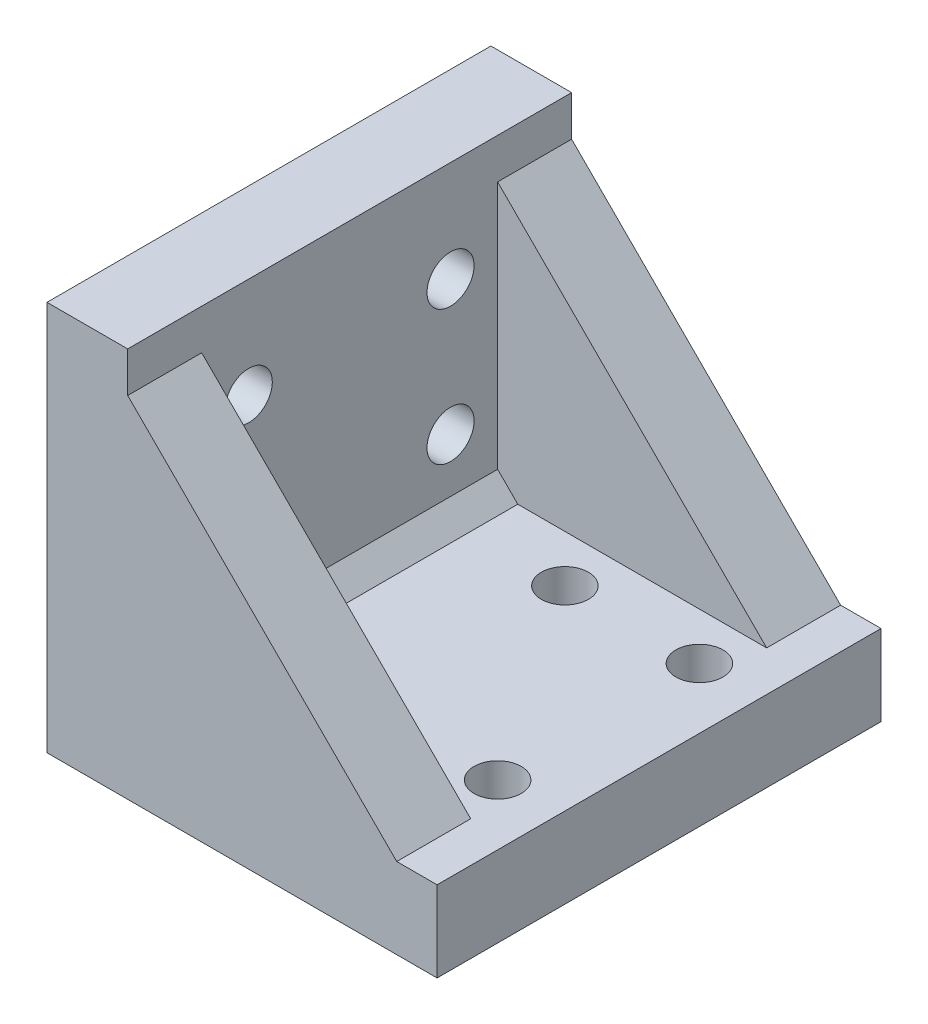
ISO-10303-21;
HEADER;
FILE_DESCRIPTION(('STEP AP214'),'2;1');
FILE_NAME('part.step','',(''),(''),'','','');
FILE_SCHEMA(('AUTOMOTIVE_DESIGN { 1 0 10303 214 1 1 1 1 }'));
ENDSEC;
DATA;
#1=APPLICATION_CONTEXT('core data for automotive mechanical design processes');
#2=APPLICATION_PROTOCOL_DEFINITION('international standard','automotive_design',2000,#1);
#3=PRODUCT_CONTEXT('',#1,'mechanical');
#4=PRODUCT('Part','Part','',(#3));
#5=PRODUCT_RELATED_PRODUCT_CATEGORY('part','',(#4));
#6=PRODUCT_DEFINITION_FORMATION('','',#4);
#7=PRODUCT_DEFINITION_CONTEXT('part definition',#1,'design');
#8=PRODUCT_DEFINITION('design','',#6,#7);
#9=PRODUCT_DEFINITION_SHAPE('','',#8);
#10=(LENGTH_UNIT() NAMED_UNIT(*) SI_UNIT(.MILLI.,.METRE.));
#11=(NAMED_UNIT(*) PLANE_ANGLE_UNIT() SI_UNIT($,.RADIAN.));
#12=(NAMED_UNIT(*) SI_UNIT($,.STERADIAN.) SOLID_ANGLE_UNIT());
#13=UNCERTAINTY_MEASURE_WITH_UNIT(LENGTH_MEASURE(1.E-05),#10,'distance_accuracy_value','');
#14=(GEOMETRIC_REPRESENTATION_CONTEXT(3) GLOBAL_UNCERTAINTY_ASSIGNED_CONTEXT((#13)) GLOBAL_UNIT_ASSIGNED_CONTEXT((#10,
#11,#12)) REPRESENTATION_CONTEXT('',''));
#15=CARTESIAN_POINT('',(0.,0.,0.));
#16=DIRECTION('',(0.,0.,1.));
#17=DIRECTION('',(1.,0.,0.));
#18=AXIS2_PLACEMENT_3D('',#15,#16,#17);
#19=CARTESIAN_POINT('',(6.,6.,16.5));
#20=DIRECTION('',(0.,-1.,0.));
#21=DIRECTION('',(1.,0.,0.));
#22=AXIS2_PLACEMENT_3D('',#19,#20,#21);
#23=PLANE('',#22);
#24=CARTESIAN_POINT('',(14.5,6.,7.5));
#25=DIRECTION('',(0.,1.,0.));
#26=DIRECTION('',(-1.,0.,0.));
#27=AXIS2_PLACEMENT_3D('',#24,#25,#26);
#28=CIRCLE('',#27,1.75);
#29=CARTESIAN_POINT('',(12.75,6.,7.5));
#30=VERTEX_POINT('',#29);
#31=EDGE_CURVE('E151',#30,#30,#28,.T.);
#32=ORIENTED_EDGE('',*,*,#31,.F.);
#33=EDGE_LOOP('',(#32));
#34=FACE_BOUND('',#33,.T.);
#35=CARTESIAN_POINT('',(14.5,6.,-7.5));
#36=DIRECTION('',(0.,1.,0.));
#37=DIRECTION('',(-1.,0.,0.));
#38=AXIS2_PLACEMENT_3D('',#35,#36,#37);
#39=CIRCLE('',#38,1.75);
#40=CARTESIAN_POINT('',(12.75,6.,-7.5));
#41=VERTEX_POINT('',#40);
#42=EDGE_CURVE('E144',#41,#41,#39,.T.);
#43=ORIENTED_EDGE('',*,*,#42,.F.);
#44=EDGE_LOOP('',(#43));
#45=FACE_BOUND('',#44,.T.);
#46=CARTESIAN_POINT('',(24.5,6.,-7.5));
#47=DIRECTION('',(0.,1.,0.));
#48=DIRECTION('',(-1.,0.,0.));
#49=AXIS2_PLACEMENT_3D('',#46,#47,#48);
#50=CIRCLE('',#49,1.75);
#51=CARTESIAN_POINT('',(22.75,6.,-7.5));
#52=VERTEX_POINT('',#51);
#53=EDGE_CURVE('E152',#52,#52,#50,.T.);
#54=ORIENTED_EDGE('',*,*,#53,.F.);
#55=EDGE_LOOP('',(#54));
#56=FACE_BOUND('',#55,.T.);
#57=CARTESIAN_POINT('',(24.5,6.,7.5));
#58=DIRECTION('',(0.,1.,0.));
#59=DIRECTION('',(-1.,0.,0.));
#60=AXIS2_PLACEMENT_3D('',#57,#58,#59);
#61=CIRCLE('',#60,1.75);
#62=CARTESIAN_POINT('',(22.75,6.,7.5));
#63=VERTEX_POINT('',#62);
#64=EDGE_CURVE('E142',#63,#63,#61,.T.);
#65=ORIENTED_EDGE('',*,*,#64,.F.);
#66=EDGE_LOOP('',(#65));
#67=FACE_BOUND('',#66,.T.);
#68=DIRECTION('',(1.,0.,0.));
#69=VECTOR('',#68,1.);
#70=CARTESIAN_POINT('',(26.,6.,-11.));
#71=LINE('',#70,#69);
#72=CARTESIAN_POINT('',(7.5,6.,-11.));
#73=VERTEX_POINT('',#72);
#74=CARTESIAN_POINT('',(26.,6.,-11.));
#75=VERTEX_POINT('',#74);
#76=EDGE_CURVE('E247',#73,#75,#71,.T.);
#77=ORIENTED_EDGE('',*,*,#76,.F.);
#78=DIRECTION('',(0.,0.,1.));
#79=VECTOR('',#78,1.);
#80=CARTESIAN_POINT('',(7.5,6.,11.));
#81=LINE('',#80,#79);
#82=CARTESIAN_POINT('',(7.5,6.,11.));
#83=VERTEX_POINT('',#82);
#84=EDGE_CURVE('E45',#73,#83,#81,.T.);
#85=ORIENTED_EDGE('',*,*,#84,.T.);
#86=DIRECTION('',(1.,0.,0.));
#87=VECTOR('',#86,1.);
#88=CARTESIAN_POINT('',(26.,6.,11.));
#89=LINE('',#88,#87);
#90=CARTESIAN_POINT('',(26.,6.,11.));
#91=VERTEX_POINT('',#90);
#92=EDGE_CURVE('E116',#83,#91,#89,.T.);
#93=ORIENTED_EDGE('',*,*,#92,.T.);
#94=DIRECTION('',(0.,0.,1.));
#95=VECTOR('',#94,1.);
#96=CARTESIAN_POINT('',(26.,6.,11.));
#97=LINE('',#96,#95);
#98=CARTESIAN_POINT('',(26.,6.,16.5));
#99=VERTEX_POINT('',#98);
#100=EDGE_CURVE('E119',#91,#99,#97,.T.);
#101=ORIENTED_EDGE('',*,*,#100,.T.);
#102=DIRECTION('',(-1.,0.,0.));
#103=VECTOR('',#102,1.);
#104=CARTESIAN_POINT('',(6.,6.,16.5));
#105=LINE('',#104,#103);
#106=CARTESIAN_POINT('',(29.,6.,16.5));
#107=VERTEX_POINT('',#106);
#108=EDGE_CURVE('E198',#107,#99,#105,.T.);
#109=ORIENTED_EDGE('',*,*,#108,.F.);
#110=DIRECTION('',(0.,0.,-1.));
#111=VECTOR('',#110,1.);
#112=CARTESIAN_POINT('',(29.,6.,16.5));
#113=LINE('',#112,#111);
#114=CARTESIAN_POINT('',(29.,6.,-16.5));
#115=VERTEX_POINT('',#114);
#116=EDGE_CURVE('E226',#107,#115,#113,.T.);
#117=ORIENTED_EDGE('',*,*,#116,.T.);
#118=DIRECTION('',(-1.,0.,0.));
#119=VECTOR('',#118,1.);
#120=CARTESIAN_POINT('',(6.,6.,-16.5));
#121=LINE('',#120,#119);
#122=CARTESIAN_POINT('',(26.,6.,-16.5));
#123=VERTEX_POINT('',#122);
#124=EDGE_CURVE('E211',#115,#123,#121,.T.);
#125=ORIENTED_EDGE('',*,*,#124,.T.);
#126=DIRECTION('',(0.,0.,-1.));
#127=VECTOR('',#126,1.);
#128=CARTESIAN_POINT('',(26.,6.,-11.));
#129=LINE('',#128,#127);
#130=EDGE_CURVE('E141',#75,#123,#129,.T.);
#131=ORIENTED_EDGE('',*,*,#130,.F.);
#132=EDGE_LOOP('',(#77,#85,#93,#101,#109,#117,#125,#131));
#133=FACE_BOUND('',#132,.T.);
#134=ADVANCED_FACE('F36',(#34,#45,#56,#67,#133),#23,.F.);
#135=CARTESIAN_POINT('',(5.99999999999999,29.,16.5));
#136=DIRECTION('',(-1.,0.,0.));
#137=DIRECTION('',(0.,-1.,0.));
#138=AXIS2_PLACEMENT_3D('',#135,#136,#137);
#139=PLANE('',#138);
#140=CARTESIAN_POINT('',(6.,21.5,-7.5));
#141=DIRECTION('',(1.,0.,0.));
#142=DIRECTION('',(0.,1.,0.));
#143=AXIS2_PLACEMENT_3D('',#140,#141,#142);
#144=CIRCLE('',#143,1.75);
#145=CARTESIAN_POINT('',(6.,23.25,-7.5));
#146=VERTEX_POINT('',#145);
#147=EDGE_CURVE('E175',#146,#146,#144,.T.);
#148=ORIENTED_EDGE('',*,*,#147,.F.);
#149=EDGE_LOOP('',(#148));
#150=FACE_BOUND('',#149,.T.);
#151=CARTESIAN_POINT('',(6.,11.5,-7.5));
#152=DIRECTION('',(1.,0.,0.));
#153=DIRECTION('',(0.,1.,0.));
#154=AXIS2_PLACEMENT_3D('',#151,#152,#153);
#155=CIRCLE('',#154,1.75);
#156=CARTESIAN_POINT('',(6.,13.25,-7.5));
#157=VERTEX_POINT('',#156);
#158=EDGE_CURVE('E168',#157,#157,#155,.T.);
#159=ORIENTED_EDGE('',*,*,#158,.F.);
#160=EDGE_LOOP('',(#159));
#161=FACE_BOUND('',#160,.T.);
#162=CARTESIAN_POINT('',(6.,11.5,7.5));
#163=DIRECTION('',(1.,0.,0.));
#164=DIRECTION('',(0.,1.,0.));
#165=AXIS2_PLACEMENT_3D('',#162,#163,#164);
#166=CIRCLE('',#165,1.75);
#167=CARTESIAN_POINT('',(6.,13.25,7.5));
#168=VERTEX_POINT('',#167);
#169=EDGE_CURVE('E176',#168,#168,#166,.T.);
#170=ORIENTED_EDGE('',*,*,#169,.F.);
#171=EDGE_LOOP('',(#170));
#172=FACE_BOUND('',#171,.T.);
#173=CARTESIAN_POINT('',(6.,21.5,7.5));
#174=DIRECTION('',(1.,0.,0.));
#175=DIRECTION('',(0.,1.,0.));
#176=AXIS2_PLACEMENT_3D('',#173,#174,#175);
#177=CIRCLE('',#176,1.75);
#178=CARTESIAN_POINT('',(6.,23.25,7.5));
#179=VERTEX_POINT('',#178);
#180=EDGE_CURVE('E167',#179,#179,#177,.T.);
#181=ORIENTED_EDGE('',*,*,#180,.F.);
#182=EDGE_LOOP('',(#181));
#183=FACE_BOUND('',#182,.T.);
#184=DIRECTION('',(0.,-1.,0.));
#185=VECTOR('',#184,1.);
#186=CARTESIAN_POINT('',(6.,6.,11.));
#187=LINE('',#186,#185);
#188=CARTESIAN_POINT('',(6.,26.,11.));
#189=VERTEX_POINT('',#188);
#190=CARTESIAN_POINT('',(6.,7.50000000000001,11.));
#191=VERTEX_POINT('',#190);
#192=EDGE_CURVE('E125',#189,#191,#187,.T.);
#193=ORIENTED_EDGE('',*,*,#192,.T.);
#194=DIRECTION('',(0.,0.,-1.));
#195=VECTOR('',#194,1.);
#196=CARTESIAN_POINT('',(6.,7.50000000000001,-11.));
#197=LINE('',#196,#195);
#198=CARTESIAN_POINT('',(6.,7.50000000000001,-11.));
#199=VERTEX_POINT('',#198);
#200=EDGE_CURVE('E232',#191,#199,#197,.T.);
#201=ORIENTED_EDGE('',*,*,#200,.T.);
#202=DIRECTION('',(0.,-1.,0.));
#203=VECTOR('',#202,1.);
#204=CARTESIAN_POINT('',(6.,6.,-11.));
#205=LINE('',#204,#203);
#206=CARTESIAN_POINT('',(6.,26.,-11.));
#207=VERTEX_POINT('',#206);
#208=EDGE_CURVE('E238',#207,#199,#205,.T.);
#209=ORIENTED_EDGE('',*,*,#208,.F.);
#210=DIRECTION('',(0.,0.,-1.));
#211=VECTOR('',#210,1.);
#212=CARTESIAN_POINT('',(6.,26.,-11.));
#213=LINE('',#212,#211);
#214=CARTESIAN_POINT('',(5.99999999999999,26.,-16.5));
#215=VERTEX_POINT('',#214);
#216=EDGE_CURVE('E252',#207,#215,#213,.T.);
#217=ORIENTED_EDGE('',*,*,#216,.T.);
#218=DIRECTION('',(0.,1.,0.));
#219=VECTOR('',#218,1.);
#220=CARTESIAN_POINT('',(5.99999999999999,29.,-16.5));
#221=LINE('',#220,#219);
#222=CARTESIAN_POINT('',(5.99999999999999,29.,-16.5));
#223=VERTEX_POINT('',#222);
#224=EDGE_CURVE('E213',#215,#223,#221,.T.);
#225=ORIENTED_EDGE('',*,*,#224,.T.);
#226=DIRECTION('',(0.,0.,-1.));
#227=VECTOR('',#226,1.);
#228=CARTESIAN_POINT('',(5.99999999999999,29.,16.5));
#229=LINE('',#228,#227);
#230=CARTESIAN_POINT('',(5.99999999999999,29.,16.5));
#231=VERTEX_POINT('',#230);
#232=EDGE_CURVE('E223',#231,#223,#229,.T.);
#233=ORIENTED_EDGE('',*,*,#232,.F.);
#234=DIRECTION('',(0.,1.,0.));
#235=VECTOR('',#234,1.);
#236=CARTESIAN_POINT('',(5.99999999999999,29.,16.5));
#237=LINE('',#236,#235);
#238=CARTESIAN_POINT('',(6.,26.,16.5));
#239=VERTEX_POINT('',#238);
#240=EDGE_CURVE('E200',#239,#231,#237,.T.);
#241=ORIENTED_EDGE('',*,*,#240,.F.);
#242=DIRECTION('',(0.,0.,1.));
#243=VECTOR('',#242,1.);
#244=CARTESIAN_POINT('',(6.,26.,11.));
#245=LINE('',#244,#243);
#246=EDGE_CURVE('E133',#189,#239,#245,.T.);
#247=ORIENTED_EDGE('',*,*,#246,.F.);
#248=EDGE_LOOP('',(#193,#201,#209,#217,#225,#233,#241,#247));
#249=FACE_BOUND('',#248,.T.);
#250=ADVANCED_FACE('F237',(#150,#161,#172,#183,#249),#139,.F.);
#251=CARTESIAN_POINT('',(29.,0.,16.5));
#252=DIRECTION('',(0.,1.,0.));
#253=DIRECTION('',(-1.,0.,0.));
#254=AXIS2_PLACEMENT_3D('',#251,#252,#253);
#255=PLANE('',#254);
#256=CARTESIAN_POINT('',(24.5,0.,7.5));
#257=DIRECTION('',(0.,1.,0.));
#258=DIRECTION('',(-1.,0.,0.));
#259=AXIS2_PLACEMENT_3D('',#256,#257,#258);
#260=CIRCLE('',#259,1.75);
#261=CARTESIAN_POINT('',(22.75,0.,7.5));
#262=VERTEX_POINT('',#261);
#263=EDGE_CURVE('E155',#262,#262,#260,.F.);
#264=ORIENTED_EDGE('',*,*,#263,.F.);
#265=EDGE_LOOP('',(#264));
#266=FACE_BOUND('',#265,.T.);
#267=CARTESIAN_POINT('',(24.5,0.,-7.5));
#268=DIRECTION('',(0.,1.,0.));
#269=DIRECTION('',(-1.,0.,0.));
#270=AXIS2_PLACEMENT_3D('',#267,#268,#269);
#271=CIRCLE('',#270,1.75);
#272=CARTESIAN_POINT('',(22.75,0.,-7.5));
#273=VERTEX_POINT('',#272);
#274=EDGE_CURVE('E148',#273,#273,#271,.F.);
#275=ORIENTED_EDGE('',*,*,#274,.F.);
#276=EDGE_LOOP('',(#275));
#277=FACE_BOUND('',#276,.T.);
#278=CARTESIAN_POINT('',(14.5,0.,-7.5));
#279=DIRECTION('',(0.,1.,0.));
#280=DIRECTION('',(-1.,0.,0.));
#281=AXIS2_PLACEMENT_3D('',#278,#279,#280);
#282=CIRCLE('',#281,1.75);
#283=CARTESIAN_POINT('',(12.75,0.,-7.5));
#284=VERTEX_POINT('',#283);
#285=EDGE_CURVE('E147',#284,#284,#282,.F.);
#286=ORIENTED_EDGE('',*,*,#285,.F.);
#287=EDGE_LOOP('',(#286));
#288=FACE_BOUND('',#287,.T.);
#289=CARTESIAN_POINT('',(14.5,0.,7.5));
#290=DIRECTION('',(0.,1.,0.));
#291=DIRECTION('',(-1.,0.,0.));
#292=AXIS2_PLACEMENT_3D('',#289,#290,#291);
#293=CIRCLE('',#292,1.75);
#294=CARTESIAN_POINT('',(12.75,0.,7.5));
#295=VERTEX_POINT('',#294);
#296=EDGE_CURVE('E164',#295,#295,#293,.F.);
#297=ORIENTED_EDGE('',*,*,#296,.F.);
#298=EDGE_LOOP('',(#297));
#299=FACE_BOUND('',#298,.T.);
#300=DIRECTION('',(1.,0.,0.));
#301=VECTOR('',#300,1.);
#302=CARTESIAN_POINT('',(29.,0.,-16.5));
#303=LINE('',#302,#301);
#304=CARTESIAN_POINT('',(0.,0.,-16.5));
#305=VERTEX_POINT('',#304);
#306=CARTESIAN_POINT('',(29.,0.,-16.5));
#307=VERTEX_POINT('',#306);
#308=EDGE_CURVE('E191',#305,#307,#303,.T.);
#309=ORIENTED_EDGE('',*,*,#308,.T.);
#310=DIRECTION('',(0.,0.,-1.));
#311=VECTOR('',#310,1.);
#312=CARTESIAN_POINT('',(29.,0.,16.5));
#313=LINE('',#312,#311);
#314=CARTESIAN_POINT('',(29.,0.,16.5));
#315=VERTEX_POINT('',#314);
#316=EDGE_CURVE('E229',#315,#307,#313,.T.);
#317=ORIENTED_EDGE('',*,*,#316,.F.);
#318=DIRECTION('',(1.,0.,0.));
#319=VECTOR('',#318,1.);
#320=CARTESIAN_POINT('',(29.,0.,16.5));
#321=LINE('',#320,#319);
#322=CARTESIAN_POINT('',(0.,0.,16.5));
#323=VERTEX_POINT('',#322);
#324=EDGE_CURVE('E192',#323,#315,#321,.T.);
#325=ORIENTED_EDGE('',*,*,#324,.F.);
#326=DIRECTION('',(0.,0.,-1.));
#327=VECTOR('',#326,1.);
#328=CARTESIAN_POINT('',(0.,0.,16.5));
#329=LINE('',#328,#327);
#330=EDGE_CURVE('E206',#323,#305,#329,.T.);
#331=ORIENTED_EDGE('',*,*,#330,.T.);
#332=EDGE_LOOP('',(#309,#317,#325,#331));
#333=FACE_BOUND('',#332,.T.);
#334=ADVANCED_FACE('F274',(#266,#277,#288,#299,#333),#255,.F.);
#335=CARTESIAN_POINT('',(29.,6.,16.5));
#336=DIRECTION('',(-1.,0.,0.));
#337=DIRECTION('',(0.,-1.,0.));
#338=AXIS2_PLACEMENT_3D('',#335,#336,#337);
#339=PLANE('',#338);
#340=DIRECTION('',(0.,1.,0.));
#341=VECTOR('',#340,1.);
#342=CARTESIAN_POINT('',(29.,6.,-16.5));
#343=LINE('',#342,#341);
#344=EDGE_CURVE('E209',#307,#115,#343,.T.);
#345=ORIENTED_EDGE('',*,*,#344,.T.);
#346=ORIENTED_EDGE('',*,*,#116,.F.);
#347=DIRECTION('',(0.,1.,0.));
#348=VECTOR('',#347,1.);
#349=CARTESIAN_POINT('',(29.,6.,16.5));
#350=LINE('',#349,#348);
#351=EDGE_CURVE('E195',#315,#107,#350,.T.);
#352=ORIENTED_EDGE('',*,*,#351,.F.);
#353=ORIENTED_EDGE('',*,*,#316,.T.);
#354=EDGE_LOOP('',(#345,#346,#352,#353));
#355=FACE_BOUND('',#354,.T.);
#356=ADVANCED_FACE('F271',(#355),#339,.F.);
#357=CARTESIAN_POINT('',(0.,29.,16.5));
#358=DIRECTION('',(0.,-1.,0.));
#359=DIRECTION('',(0.,0.,-1.));
#360=AXIS2_PLACEMENT_3D('',#357,#358,#359);
#361=PLANE('',#360);
#362=DIRECTION('',(-1.,0.,0.));
#363=VECTOR('',#362,1.);
#364=CARTESIAN_POINT('',(0.,29.,-16.5));
#365=LINE('',#364,#363);
#366=CARTESIAN_POINT('',(0.,29.,-16.5));
#367=VERTEX_POINT('',#366);
#368=EDGE_CURVE('E215',#223,#367,#365,.T.);
#369=ORIENTED_EDGE('',*,*,#368,.T.);
#370=DIRECTION('',(0.,0.,-1.));
#371=VECTOR('',#370,1.);
#372=CARTESIAN_POINT('',(0.,29.,16.5));
#373=LINE('',#372,#371);
#374=CARTESIAN_POINT('',(0.,29.,16.5));
#375=VERTEX_POINT('',#374);
#376=EDGE_CURVE('E220',#375,#367,#373,.T.);
#377=ORIENTED_EDGE('',*,*,#376,.F.);
#378=DIRECTION('',(-1.,0.,0.));
#379=VECTOR('',#378,1.);
#380=CARTESIAN_POINT('',(0.,29.,16.5));
#381=LINE('',#380,#379);
#382=EDGE_CURVE('E202',#231,#375,#381,.T.);
#383=ORIENTED_EDGE('',*,*,#382,.F.);
#384=ORIENTED_EDGE('',*,*,#232,.T.);
#385=EDGE_LOOP('',(#369,#377,#383,#384));
#386=FACE_BOUND('',#385,.T.);
#387=ADVANCED_FACE('F282',(#386),#361,.F.);
#388=CARTESIAN_POINT('',(0.,0.,16.5));
#389=DIRECTION('',(1.,0.,0.));
#390=DIRECTION('',(0.,1.,0.));
#391=AXIS2_PLACEMENT_3D('',#388,#389,#390);
#392=PLANE('',#391);
#393=CARTESIAN_POINT('',(0.,21.5,7.5));
#394=DIRECTION('',(1.,0.,0.));
#395=DIRECTION('',(0.,1.,0.));
#396=AXIS2_PLACEMENT_3D('',#393,#394,#395);
#397=CIRCLE('',#396,1.75);
#398=CARTESIAN_POINT('',(0.,23.25,7.5));
#399=VERTEX_POINT('',#398);
#400=EDGE_CURVE('E179',#399,#399,#397,.F.);
#401=ORIENTED_EDGE('',*,*,#400,.F.);
#402=EDGE_LOOP('',(#401));
#403=FACE_BOUND('',#402,.T.);
#404=CARTESIAN_POINT('',(0.,11.5,7.5));
#405=DIRECTION('',(1.,0.,0.));
#406=DIRECTION('',(0.,1.,0.));
#407=AXIS2_PLACEMENT_3D('',#404,#405,#406);
#408=CIRCLE('',#407,1.75);
#409=CARTESIAN_POINT('',(0.,13.25,7.5));
#410=VERTEX_POINT('',#409);
#411=EDGE_CURVE('E172',#410,#410,#408,.F.);
#412=ORIENTED_EDGE('',*,*,#411,.F.);
#413=EDGE_LOOP('',(#412));
#414=FACE_BOUND('',#413,.T.);
#415=CARTESIAN_POINT('',(0.,11.5,-7.5));
#416=DIRECTION('',(1.,0.,0.));
#417=DIRECTION('',(0.,1.,0.));
#418=AXIS2_PLACEMENT_3D('',#415,#416,#417);
#419=CIRCLE('',#418,1.75);
#420=CARTESIAN_POINT('',(0.,13.25,-7.5));
#421=VERTEX_POINT('',#420);
#422=EDGE_CURVE('E171',#421,#421,#419,.F.);
#423=ORIENTED_EDGE('',*,*,#422,.F.);
#424=EDGE_LOOP('',(#423));
#425=FACE_BOUND('',#424,.T.);
#426=CARTESIAN_POINT('',(0.,21.5,-7.5));
#427=DIRECTION('',(1.,0.,0.));
#428=DIRECTION('',(0.,1.,0.));
#429=AXIS2_PLACEMENT_3D('',#426,#427,#428);
#430=CIRCLE('',#429,1.75);
#431=CARTESIAN_POINT('',(0.,23.25,-7.5));
#432=VERTEX_POINT('',#431);
#433=EDGE_CURVE('E188',#432,#432,#430,.F.);
#434=ORIENTED_EDGE('',*,*,#433,.F.);
#435=EDGE_LOOP('',(#434));
#436=FACE_BOUND('',#435,.T.);
#437=DIRECTION('',(0.,-1.,0.));
#438=VECTOR('',#437,1.);
#439=CARTESIAN_POINT('',(0.,0.,-16.5));
#440=LINE('',#439,#438);
#441=EDGE_CURVE('E196',#367,#305,#440,.T.);
#442=ORIENTED_EDGE('',*,*,#441,.T.);
#443=ORIENTED_EDGE('',*,*,#330,.F.);
#444=DIRECTION('',(0.,-1.,0.));
#445=VECTOR('',#444,1.);
#446=CARTESIAN_POINT('',(0.,0.,16.5));
#447=LINE('',#446,#445);
#448=EDGE_CURVE('E204',#375,#323,#447,.T.);
#449=ORIENTED_EDGE('',*,*,#448,.F.);
#450=ORIENTED_EDGE('',*,*,#376,.T.);
#451=EDGE_LOOP('',(#442,#443,#449,#450));
#452=FACE_BOUND('',#451,.T.);
#453=ADVANCED_FACE('F278',(#403,#414,#425,#436,#452),#392,.F.);
#454=CARTESIAN_POINT('',(0.,0.,16.5));
#455=DIRECTION('',(0.,0.,-1.));
#456=DIRECTION('',(-1.,0.,0.));
#457=AXIS2_PLACEMENT_3D('',#454,#455,#456);
#458=PLANE('',#457);
#459=DIRECTION('',(-0.707106781186548,0.707106781186547,0.));
#460=VECTOR('',#459,1.);
#461=CARTESIAN_POINT('',(6.,26.,16.5));
#462=LINE('',#461,#460);
#463=EDGE_CURVE('E132',#99,#239,#462,.T.);
#464=ORIENTED_EDGE('',*,*,#463,.T.);
#465=ORIENTED_EDGE('',*,*,#240,.T.);
#466=ORIENTED_EDGE('',*,*,#382,.T.);
#467=ORIENTED_EDGE('',*,*,#448,.T.);
#468=ORIENTED_EDGE('',*,*,#324,.T.);
#469=ORIENTED_EDGE('',*,*,#351,.T.);
#470=ORIENTED_EDGE('',*,*,#108,.T.);
#471=EDGE_LOOP('',(#464,#465,#466,#467,#468,#469,#470));
#472=FACE_BOUND('',#471,.T.);
#473=ADVANCED_FACE('F285',(#472),#458,.F.);
#474=CARTESIAN_POINT('',(0.,0.,-16.5));
#475=DIRECTION('',(0.,0.,-1.));
#476=DIRECTION('',(-1.,0.,0.));
#477=AXIS2_PLACEMENT_3D('',#474,#475,#476);
#478=PLANE('',#477);
#479=ORIENTED_EDGE('',*,*,#224,.F.);
#480=DIRECTION('',(-0.707106781186548,0.707106781186547,0.));
#481=VECTOR('',#480,1.);
#482=CARTESIAN_POINT('',(6.,26.,-16.5));
#483=LINE('',#482,#481);
#484=EDGE_CURVE('E245',#123,#215,#483,.T.);
#485=ORIENTED_EDGE('',*,*,#484,.F.);
#486=ORIENTED_EDGE('',*,*,#124,.F.);
#487=ORIENTED_EDGE('',*,*,#344,.F.);
#488=ORIENTED_EDGE('',*,*,#308,.F.);
#489=ORIENTED_EDGE('',*,*,#441,.F.);
#490=ORIENTED_EDGE('',*,*,#368,.F.);
#491=EDGE_LOOP('',(#479,#485,#486,#487,#488,#489,#490));
#492=FACE_BOUND('',#491,.T.);
#493=ADVANCED_FACE('F262',(#492),#478,.T.);
#494=CARTESIAN_POINT('',(-0.00100000000000881,21.5,-7.5));
#495=DIRECTION('',(1.,0.,0.));
#496=DIRECTION('',(0.,1.,0.));
#497=AXIS2_PLACEMENT_3D('',#494,#495,#496);
#498=CYLINDRICAL_SURFACE('',#497,1.75);
#499=ORIENTED_EDGE('',*,*,#147,.T.);
#500=EDGE_LOOP('',(#499));
#501=FACE_BOUND('',#500,.T.);
#502=ORIENTED_EDGE('',*,*,#433,.T.);
#503=EDGE_LOOP('',(#502));
#504=FACE_BOUND('',#503,.T.);
#505=ADVANCED_FACE('F292',(#501,#504),#498,.F.);
#506=CARTESIAN_POINT('',(-0.00100000000000794,11.5,-7.5));
#507=DIRECTION('',(1.,0.,0.));
#508=DIRECTION('',(0.,1.,0.));
#509=AXIS2_PLACEMENT_3D('',#506,#507,#508);
#510=CYLINDRICAL_SURFACE('',#509,1.75);
#511=ORIENTED_EDGE('',*,*,#158,.T.);
#512=EDGE_LOOP('',(#511));
#513=FACE_BOUND('',#512,.T.);
#514=ORIENTED_EDGE('',*,*,#422,.T.);
#515=EDGE_LOOP('',(#514));
#516=FACE_BOUND('',#515,.T.);
#517=ADVANCED_FACE('F342',(#513,#516),#510,.F.);
#518=CARTESIAN_POINT('',(-0.00100000000000794,11.5,7.5));
#519=DIRECTION('',(1.,0.,0.));
#520=DIRECTION('',(0.,1.,0.));
#521=AXIS2_PLACEMENT_3D('',#518,#519,#520);
#522=CYLINDRICAL_SURFACE('',#521,1.75);
#523=ORIENTED_EDGE('',*,*,#169,.T.);
#524=EDGE_LOOP('',(#523));
#525=FACE_BOUND('',#524,.T.);
#526=ORIENTED_EDGE('',*,*,#411,.T.);
#527=EDGE_LOOP('',(#526));
#528=FACE_BOUND('',#527,.T.);
#529=ADVANCED_FACE('F335',(#525,#528),#522,.F.);
#530=CARTESIAN_POINT('',(-0.00100000000000881,21.5,7.5));
#531=DIRECTION('',(1.,0.,0.));
#532=DIRECTION('',(0.,1.,0.));
#533=AXIS2_PLACEMENT_3D('',#530,#531,#532);
#534=CYLINDRICAL_SURFACE('',#533,1.75);
#535=ORIENTED_EDGE('',*,*,#180,.T.);
#536=EDGE_LOOP('',(#535));
#537=FACE_BOUND('',#536,.T.);
#538=ORIENTED_EDGE('',*,*,#400,.T.);
#539=EDGE_LOOP('',(#538));
#540=FACE_BOUND('',#539,.T.);
#541=ADVANCED_FACE('F325',(#537,#540),#534,.F.);
#542=CARTESIAN_POINT('',(14.5,-0.00100000000000187,7.5));
#543=DIRECTION('',(0.,1.,0.));
#544=DIRECTION('',(-1.,0.,0.));
#545=AXIS2_PLACEMENT_3D('',#542,#543,#544);
#546=CYLINDRICAL_SURFACE('',#545,1.75);
#547=ORIENTED_EDGE('',*,*,#31,.T.);
#548=EDGE_LOOP('',(#547));
#549=FACE_BOUND('',#548,.T.);
#550=ORIENTED_EDGE('',*,*,#296,.T.);
#551=EDGE_LOOP('',(#550));
#552=FACE_BOUND('',#551,.T.);
#553=ADVANCED_FACE('F322',(#549,#552),#546,.F.);
#554=CARTESIAN_POINT('',(14.5,-0.00100000000000187,-7.5));
#555=DIRECTION('',(0.,1.,0.));
#556=DIRECTION('',(-1.,0.,0.));
#557=AXIS2_PLACEMENT_3D('',#554,#555,#556);
#558=CYLINDRICAL_SURFACE('',#557,1.75);
#559=ORIENTED_EDGE('',*,*,#42,.T.);
#560=EDGE_LOOP('',(#559));
#561=FACE_BOUND('',#560,.T.);
#562=ORIENTED_EDGE('',*,*,#285,.T.);
#563=EDGE_LOOP('',(#562));
#564=FACE_BOUND('',#563,.T.);
#565=ADVANCED_FACE('F324',(#561,#564),#558,.F.);
#566=CARTESIAN_POINT('',(24.5,-0.001000000000001,-7.5));
#567=DIRECTION('',(0.,1.,0.));
#568=DIRECTION('',(-1.,0.,0.));
#569=AXIS2_PLACEMENT_3D('',#566,#567,#568);
#570=CYLINDRICAL_SURFACE('',#569,1.75);
#571=ORIENTED_EDGE('',*,*,#53,.T.);
#572=EDGE_LOOP('',(#571));
#573=FACE_BOUND('',#572,.T.);
#574=ORIENTED_EDGE('',*,*,#274,.T.);
#575=EDGE_LOOP('',(#574));
#576=FACE_BOUND('',#575,.T.);
#577=ADVANCED_FACE('F332',(#573,#576),#570,.F.);
#578=CARTESIAN_POINT('',(24.5,-0.001000000000001,7.5));
#579=DIRECTION('',(0.,1.,0.));
#580=DIRECTION('',(-1.,0.,0.));
#581=AXIS2_PLACEMENT_3D('',#578,#579,#580);
#582=CYLINDRICAL_SURFACE('',#581,1.75);
#583=ORIENTED_EDGE('',*,*,#64,.T.);
#584=EDGE_LOOP('',(#583));
#585=FACE_BOUND('',#584,.T.);
#586=ORIENTED_EDGE('',*,*,#263,.T.);
#587=EDGE_LOOP('',(#586));
#588=FACE_BOUND('',#587,.T.);
#589=ADVANCED_FACE('F340',(#585,#588),#582,.F.);
#590=CARTESIAN_POINT('',(6.,26.,11.));
#591=DIRECTION('',(0.707106781186547,0.707106781186548,0.));
#592=DIRECTION('',(-0.707106781186548,0.707106781186547,0.));
#593=AXIS2_PLACEMENT_3D('',#590,#591,#592);
#594=PLANE('',#593);
#595=ORIENTED_EDGE('',*,*,#463,.F.);
#596=ORIENTED_EDGE('',*,*,#100,.F.);
#597=DIRECTION('',(-0.707106781186548,0.707106781186547,0.));
#598=VECTOR('',#597,1.);
#599=CARTESIAN_POINT('',(6.,26.,11.));
#600=LINE('',#599,#598);
#601=EDGE_CURVE('E124',#91,#189,#600,.T.);
#602=ORIENTED_EDGE('',*,*,#601,.T.);
#603=ORIENTED_EDGE('',*,*,#246,.T.);
#604=EDGE_LOOP('',(#595,#596,#602,#603));
#605=FACE_BOUND('',#604,.T.);
#606=ADVANCED_FACE('F129',(#605),#594,.T.);
#607=CARTESIAN_POINT('',(0.,0.,11.));
#608=DIRECTION('',(0.,0.,1.));
#609=DIRECTION('',(1.,0.,0.));
#610=AXIS2_PLACEMENT_3D('',#607,#608,#609);
#611=PLANE('',#610);
#612=ORIENTED_EDGE('',*,*,#92,.F.);
#613=DIRECTION('',(0.707106781186544,-0.707106781186551,0.));
#614=VECTOR('',#613,1.);
#615=CARTESIAN_POINT('',(6.,7.50000000000001,11.));
#616=LINE('',#615,#614);
#617=EDGE_CURVE('E11',#83,#191,#616,.F.);
#618=ORIENTED_EDGE('',*,*,#617,.T.);
#619=ORIENTED_EDGE('',*,*,#192,.F.);
#620=ORIENTED_EDGE('',*,*,#601,.F.);
#621=EDGE_LOOP('',(#612,#618,#619,#620));
#622=FACE_BOUND('',#621,.T.);
#623=ADVANCED_FACE('F135',(#622),#611,.F.);
#624=CARTESIAN_POINT('',(6.,26.,-11.));
#625=DIRECTION('',(-0.707106781186547,-0.707106781186548,0.));
#626=DIRECTION('',(0.707106781186548,-0.707106781186547,0.));
#627=AXIS2_PLACEMENT_3D('',#624,#625,#626);
#628=PLANE('',#627);
#629=ORIENTED_EDGE('',*,*,#484,.T.);
#630=ORIENTED_EDGE('',*,*,#216,.F.);
#631=DIRECTION('',(-0.707106781186548,0.707106781186547,0.));
#632=VECTOR('',#631,1.);
#633=CARTESIAN_POINT('',(6.,26.,-11.));
#634=LINE('',#633,#632);
#635=EDGE_CURVE('E243',#75,#207,#634,.T.);
#636=ORIENTED_EDGE('',*,*,#635,.F.);
#637=ORIENTED_EDGE('',*,*,#130,.T.);
#638=EDGE_LOOP('',(#629,#630,#636,#637));
#639=FACE_BOUND('',#638,.T.);
#640=ADVANCED_FACE('F265',(#639),#628,.F.);
#641=CARTESIAN_POINT('',(0.,0.,-11.));
#642=DIRECTION('',(0.,0.,-1.));
#643=DIRECTION('',(1.,0.,0.));
#644=AXIS2_PLACEMENT_3D('',#641,#642,#643);
#645=PLANE('',#644);
#646=ORIENTED_EDGE('',*,*,#208,.T.);
#647=DIRECTION('',(-0.707106781186544,0.707106781186551,0.));
#648=VECTOR('',#647,1.);
#649=CARTESIAN_POINT('',(6.,7.50000000000001,-11.));
#650=LINE('',#649,#648);
#651=EDGE_CURVE('E59',#199,#73,#650,.F.);
#652=ORIENTED_EDGE('',*,*,#651,.T.);
#653=ORIENTED_EDGE('',*,*,#76,.T.);
#654=ORIENTED_EDGE('',*,*,#635,.T.);
#655=EDGE_LOOP('',(#646,#652,#653,#654));
#656=FACE_BOUND('',#655,.T.);
#657=ADVANCED_FACE('F241',(#656),#645,.F.);
#658=CARTESIAN_POINT('',(6.,7.50000000000001,16.5));
#659=DIRECTION('',(0.707106781186551,0.707106781186544,0.));
#660=DIRECTION('',(0.,0.,1.));
#661=AXIS2_PLACEMENT_3D('',#658,#659,#660);
#662=PLANE('',#661);
#663=ORIENTED_EDGE('',*,*,#617,.F.);
#664=ORIENTED_EDGE('',*,*,#84,.F.);
#665=ORIENTED_EDGE('',*,*,#651,.F.);
#666=ORIENTED_EDGE('',*,*,#200,.F.);
#667=EDGE_LOOP('',(#663,#664,#665,#666));
#668=FACE_BOUND('',#667,.T.);
#669=ADVANCED_FACE('F39',(#668),#662,.T.);
#670=CLOSED_SHELL('',(#134,#250,#334,#356,#387,#453,#473,#493,#505,#517,#529,#541,#553,#565,
#577,#589,#606,#623,#640,#657,#669));
#671=MANIFOLD_SOLID_BREP('B2',#670);
#672=ADVANCED_BREP_SHAPE_REPRESENTATION('',(#18,#671),#14);
#673=SHAPE_DEFINITION_REPRESENTATION(#9,#672);
ENDSEC;
END-ISO-10303-21;
